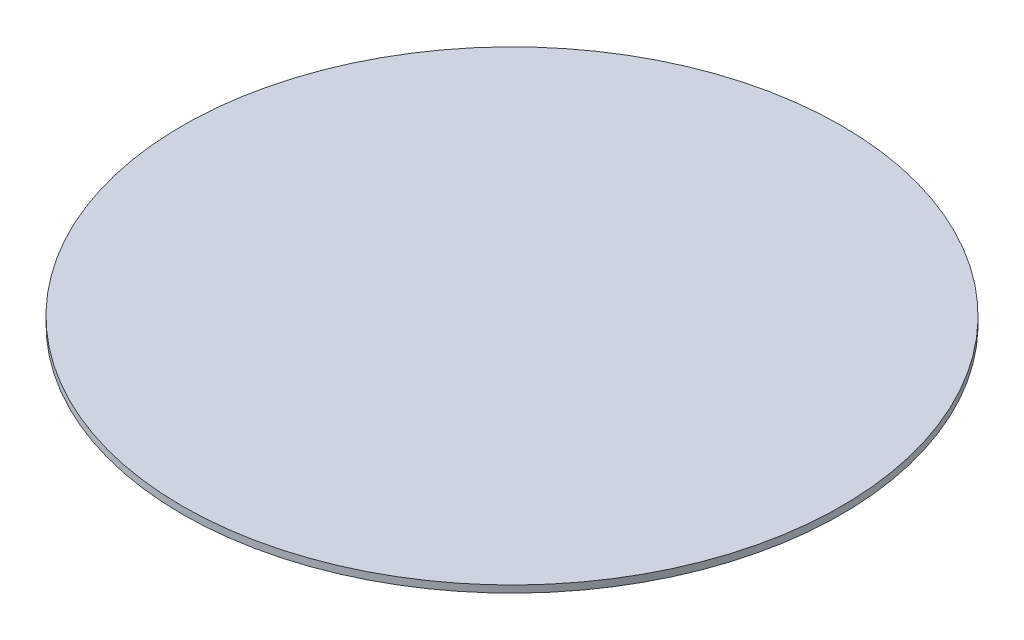
ISO-10303-21;
HEADER;
FILE_DESCRIPTION(('STEP AP214'),'2;1');
FILE_NAME('part.step','',(''),(''),'','','');
FILE_SCHEMA(('AUTOMOTIVE_DESIGN { 1 0 10303 214 1 1 1 1 }'));
ENDSEC;
DATA;
#1=APPLICATION_CONTEXT('core data for automotive mechanical design processes');
#2=APPLICATION_PROTOCOL_DEFINITION('international standard','automotive_design',2000,#1);
#3=PRODUCT_CONTEXT('',#1,'mechanical');
#4=PRODUCT('Part','Part','',(#3));
#5=PRODUCT_RELATED_PRODUCT_CATEGORY('part','',(#4));
#6=PRODUCT_DEFINITION_FORMATION('','',#4);
#7=PRODUCT_DEFINITION_CONTEXT('part definition',#1,'design');
#8=PRODUCT_DEFINITION('design','',#6,#7);
#9=PRODUCT_DEFINITION_SHAPE('','',#8);
#10=(LENGTH_UNIT() NAMED_UNIT(*) SI_UNIT(.MILLI.,.METRE.));
#11=(NAMED_UNIT(*) PLANE_ANGLE_UNIT() SI_UNIT($,.RADIAN.));
#12=(NAMED_UNIT(*) SI_UNIT($,.STERADIAN.) SOLID_ANGLE_UNIT());
#13=UNCERTAINTY_MEASURE_WITH_UNIT(LENGTH_MEASURE(1.E-05),#10,'distance_accuracy_value','');
#14=(GEOMETRIC_REPRESENTATION_CONTEXT(3) GLOBAL_UNCERTAINTY_ASSIGNED_CONTEXT((#13)) GLOBAL_UNIT_ASSIGNED_CONTEXT((#10,
#11,#12)) REPRESENTATION_CONTEXT('',''));
#15=CARTESIAN_POINT('',(0.,0.,0.));
#16=DIRECTION('',(0.,0.,1.));
#17=DIRECTION('',(1.,0.,0.));
#18=AXIS2_PLACEMENT_3D('',#15,#16,#17);
#19=CARTESIAN_POINT('',(0.,3.,0.));
#20=DIRECTION('',(0.,-1.,0.));
#21=DIRECTION('',(0.,0.,-1.));
#22=AXIS2_PLACEMENT_3D('',#19,#20,#21);
#23=CYLINDRICAL_SURFACE('',#22,140.);
#24=CARTESIAN_POINT('',(0.,3.,0.));
#25=DIRECTION('',(0.,1.,0.));
#26=DIRECTION('',(0.,0.,1.));
#27=AXIS2_PLACEMENT_3D('',#24,#25,#26);
#28=CIRCLE('',#27,140.);
#29=CARTESIAN_POINT('',(0.,3.,140.));
#30=VERTEX_POINT('',#29);
#31=EDGE_CURVE('E10',#30,#30,#28,.T.);
#32=ORIENTED_EDGE('',*,*,#31,.F.);
#33=EDGE_LOOP('',(#32));
#34=FACE_BOUND('',#33,.T.);
#35=CARTESIAN_POINT('',(0.,0.,0.));
#36=DIRECTION('',(0.,1.,0.));
#37=DIRECTION('',(0.,0.,1.));
#38=AXIS2_PLACEMENT_3D('',#35,#36,#37);
#39=CIRCLE('',#38,140.);
#40=CARTESIAN_POINT('',(0.,0.,140.));
#41=VERTEX_POINT('',#40);
#42=EDGE_CURVE('E37',#41,#41,#39,.T.);
#43=ORIENTED_EDGE('',*,*,#42,.T.);
#44=EDGE_LOOP('',(#43));
#45=FACE_BOUND('',#44,.T.);
#46=ADVANCED_FACE('F34',(#34,#45),#23,.T.);
#47=CARTESIAN_POINT('',(0.,3.,0.));
#48=DIRECTION('',(0.,1.,0.));
#49=DIRECTION('',(0.,0.,1.));
#50=AXIS2_PLACEMENT_3D('',#47,#48,#49);
#51=PLANE('',#50);
#52=ORIENTED_EDGE('',*,*,#31,.T.);
#53=EDGE_LOOP('',(#52));
#54=FACE_BOUND('',#53,.T.);
#55=ADVANCED_FACE('F49',(#54),#51,.T.);
#56=CARTESIAN_POINT('',(0.,0.,0.));
#57=DIRECTION('',(0.,1.,0.));
#58=DIRECTION('',(0.,0.,1.));
#59=AXIS2_PLACEMENT_3D('',#56,#57,#58);
#60=PLANE('',#59);
#61=ORIENTED_EDGE('',*,*,#42,.F.);
#62=EDGE_LOOP('',(#61));
#63=FACE_BOUND('',#62,.T.);
#64=ADVANCED_FACE('F47',(#63),#60,.F.);
#65=CLOSED_SHELL('',(#46,#55,#64));
#66=MANIFOLD_SOLID_BREP('B2',#65);
#67=ADVANCED_BREP_SHAPE_REPRESENTATION('',(#18,#66),#14);
#68=SHAPE_DEFINITION_REPRESENTATION(#9,#67);
ENDSEC;
END-ISO-10303-21;
